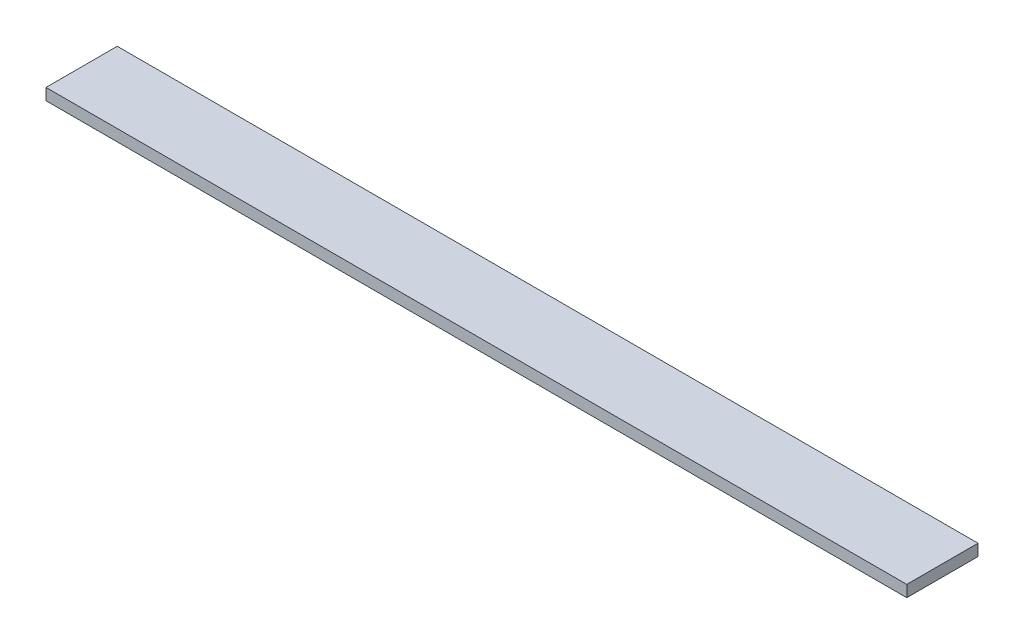
ISO-10303-21;
HEADER;
FILE_DESCRIPTION(('STEP AP214'),'2;1');
FILE_NAME('part.step','',(''),(''),'','','');
FILE_SCHEMA(('AUTOMOTIVE_DESIGN { 1 0 10303 214 1 1 1 1 }'));
ENDSEC;
DATA;
#1=APPLICATION_CONTEXT('core data for automotive mechanical design processes');
#2=APPLICATION_PROTOCOL_DEFINITION('international standard','automotive_design',2000,#1);
#3=PRODUCT_CONTEXT('',#1,'mechanical');
#4=PRODUCT('Part','Part','',(#3));
#5=PRODUCT_RELATED_PRODUCT_CATEGORY('part','',(#4));
#6=PRODUCT_DEFINITION_FORMATION('','',#4);
#7=PRODUCT_DEFINITION_CONTEXT('part definition',#1,'design');
#8=PRODUCT_DEFINITION('design','',#6,#7);
#9=PRODUCT_DEFINITION_SHAPE('','',#8);
#10=(LENGTH_UNIT() NAMED_UNIT(*) SI_UNIT(.MILLI.,.METRE.));
#11=(NAMED_UNIT(*) PLANE_ANGLE_UNIT() SI_UNIT($,.RADIAN.));
#12=(NAMED_UNIT(*) SI_UNIT($,.STERADIAN.) SOLID_ANGLE_UNIT());
#13=UNCERTAINTY_MEASURE_WITH_UNIT(LENGTH_MEASURE(1.E-05),#10,'distance_accuracy_value','');
#14=(GEOMETRIC_REPRESENTATION_CONTEXT(3) GLOBAL_UNCERTAINTY_ASSIGNED_CONTEXT((#13)) GLOBAL_UNIT_ASSIGNED_CONTEXT((#10,
#11,#12)) REPRESENTATION_CONTEXT('',''));
#15=CARTESIAN_POINT('',(0.,0.,0.));
#16=DIRECTION('',(0.,0.,1.));
#17=DIRECTION('',(1.,0.,0.));
#18=AXIS2_PLACEMENT_3D('',#15,#16,#17);
#19=CARTESIAN_POINT('',(-721.173913043478,38.1,-422.058695652174));
#20=DIRECTION('',(1.,0.,0.));
#21=DIRECTION('',(0.,0.,-1.));
#22=AXIS2_PLACEMENT_3D('',#19,#20,#21);
#23=PLANE('',#22);
#24=DIRECTION('',(0.,0.,1.));
#25=VECTOR('',#24,1.);
#26=CARTESIAN_POINT('',(-721.173913043478,0.,-422.058695652174));
#27=LINE('',#26,#25);
#28=CARTESIAN_POINT('',(-721.173913043478,0.,-422.058695652174));
#29=VERTEX_POINT('',#28);
#30=CARTESIAN_POINT('',(-721.173913043478,0.,-187.108695652174));
#31=VERTEX_POINT('',#30);
#32=EDGE_CURVE('E96',#29,#31,#27,.T.);
#33=ORIENTED_EDGE('',*,*,#32,.T.);
#34=DIRECTION('',(0.,-1.,0.));
#35=VECTOR('',#34,1.);
#36=CARTESIAN_POINT('',(-721.173913043478,38.1,-187.108695652174));
#37=LINE('',#36,#35);
#38=CARTESIAN_POINT('',(-721.173913043478,38.1,-187.108695652174));
#39=VERTEX_POINT('',#38);
#40=EDGE_CURVE('E11',#39,#31,#37,.T.);
#41=ORIENTED_EDGE('',*,*,#40,.F.);
#42=DIRECTION('',(0.,0.,1.));
#43=VECTOR('',#42,1.);
#44=CARTESIAN_POINT('',(-721.173913043478,38.1,-422.058695652174));
#45=LINE('',#44,#43);
#46=CARTESIAN_POINT('',(-721.173913043478,38.1,-422.058695652174));
#47=VERTEX_POINT('',#46);
#48=EDGE_CURVE('E82',#47,#39,#45,.T.);
#49=ORIENTED_EDGE('',*,*,#48,.F.);
#50=DIRECTION('',(0.,-1.,0.));
#51=VECTOR('',#50,1.);
#52=CARTESIAN_POINT('',(-721.173913043478,38.1,-422.058695652174));
#53=LINE('',#52,#51);
#54=EDGE_CURVE('E49',#47,#29,#53,.T.);
#55=ORIENTED_EDGE('',*,*,#54,.T.);
#56=EDGE_LOOP('',(#33,#41,#49,#55));
#57=FACE_BOUND('',#56,.T.);
#58=ADVANCED_FACE('F33',(#57),#23,.F.);
#59=CARTESIAN_POINT('',(-721.173913043478,38.1,-187.108695652174));
#60=DIRECTION('',(0.,0.,-1.));
#61=DIRECTION('',(-1.,0.,0.));
#62=AXIS2_PLACEMENT_3D('',#59,#60,#61);
#63=PLANE('',#62);
#64=DIRECTION('',(1.,0.,0.));
#65=VECTOR('',#64,1.);
#66=CARTESIAN_POINT('',(-721.173913043478,0.,-187.108695652174));
#67=LINE('',#66,#65);
#68=CARTESIAN_POINT('',(2117.27608695652,0.,-187.108695652174));
#69=VERTEX_POINT('',#68);
#70=EDGE_CURVE('E87',#31,#69,#67,.T.);
#71=ORIENTED_EDGE('',*,*,#70,.T.);
#72=DIRECTION('',(0.,-1.,0.));
#73=VECTOR('',#72,1.);
#74=CARTESIAN_POINT('',(2117.27608695652,38.1,-187.108695652174));
#75=LINE('',#74,#73);
#76=CARTESIAN_POINT('',(2117.27608695652,38.1,-187.108695652174));
#77=VERTEX_POINT('',#76);
#78=EDGE_CURVE('E41',#77,#69,#75,.T.);
#79=ORIENTED_EDGE('',*,*,#78,.F.);
#80=DIRECTION('',(1.,0.,0.));
#81=VECTOR('',#80,1.);
#82=CARTESIAN_POINT('',(-721.173913043478,38.1,-187.108695652174));
#83=LINE('',#82,#81);
#84=EDGE_CURVE('E74',#39,#77,#83,.T.);
#85=ORIENTED_EDGE('',*,*,#84,.F.);
#86=ORIENTED_EDGE('',*,*,#40,.T.);
#87=EDGE_LOOP('',(#71,#79,#85,#86));
#88=FACE_BOUND('',#87,.T.);
#89=ADVANCED_FACE('F86',(#88),#63,.F.);
#90=CARTESIAN_POINT('',(2117.27608695652,38.1,-422.058695652174));
#91=DIRECTION('',(1.,0.,0.));
#92=DIRECTION('',(0.,0.,-1.));
#93=AXIS2_PLACEMENT_3D('',#90,#91,#92);
#94=PLANE('',#93);
#95=DIRECTION('',(0.,0.,1.));
#96=VECTOR('',#95,1.);
#97=CARTESIAN_POINT('',(2117.27608695652,0.,-422.058695652174));
#98=LINE('',#97,#96);
#99=CARTESIAN_POINT('',(2117.27608695652,0.,-422.058695652174));
#100=VERTEX_POINT('',#99);
#101=EDGE_CURVE('E99',#100,#69,#98,.T.);
#102=ORIENTED_EDGE('',*,*,#101,.F.);
#103=DIRECTION('',(0.,-1.,0.));
#104=VECTOR('',#103,1.);
#105=CARTESIAN_POINT('',(2117.27608695652,38.1,-422.058695652174));
#106=LINE('',#105,#104);
#107=CARTESIAN_POINT('',(2117.27608695652,38.1,-422.058695652174));
#108=VERTEX_POINT('',#107);
#109=EDGE_CURVE('E63',#108,#100,#106,.T.);
#110=ORIENTED_EDGE('',*,*,#109,.F.);
#111=DIRECTION('',(0.,0.,1.));
#112=VECTOR('',#111,1.);
#113=CARTESIAN_POINT('',(2117.27608695652,38.1,-422.058695652174));
#114=LINE('',#113,#112);
#115=EDGE_CURVE('E81',#108,#77,#114,.T.);
#116=ORIENTED_EDGE('',*,*,#115,.T.);
#117=ORIENTED_EDGE('',*,*,#78,.T.);
#118=EDGE_LOOP('',(#102,#110,#116,#117));
#119=FACE_BOUND('',#118,.T.);
#120=ADVANCED_FACE('F90',(#119),#94,.T.);
#121=CARTESIAN_POINT('',(-721.173913043478,38.1,-422.058695652174));
#122=DIRECTION('',(0.,0.,-1.));
#123=DIRECTION('',(-1.,0.,0.));
#124=AXIS2_PLACEMENT_3D('',#121,#122,#123);
#125=PLANE('',#124);
#126=DIRECTION('',(1.,0.,0.));
#127=VECTOR('',#126,1.);
#128=CARTESIAN_POINT('',(-721.173913043478,0.,-422.058695652174));
#129=LINE('',#128,#127);
#130=EDGE_CURVE('E101',#29,#100,#129,.T.);
#131=ORIENTED_EDGE('',*,*,#130,.F.);
#132=ORIENTED_EDGE('',*,*,#54,.F.);
#133=DIRECTION('',(1.,0.,0.));
#134=VECTOR('',#133,1.);
#135=CARTESIAN_POINT('',(-721.173913043478,38.1,-422.058695652174));
#136=LINE('',#135,#134);
#137=EDGE_CURVE('E91',#47,#108,#136,.T.);
#138=ORIENTED_EDGE('',*,*,#137,.T.);
#139=ORIENTED_EDGE('',*,*,#109,.T.);
#140=EDGE_LOOP('',(#131,#132,#138,#139));
#141=FACE_BOUND('',#140,.T.);
#142=ADVANCED_FACE('F107',(#141),#125,.T.);
#143=CARTESIAN_POINT('',(0.,38.1,0.));
#144=DIRECTION('',(0.,1.,0.));
#145=DIRECTION('',(0.,0.,1.));
#146=AXIS2_PLACEMENT_3D('',#143,#144,#145);
#147=PLANE('',#146);
#148=ORIENTED_EDGE('',*,*,#48,.T.);
#149=ORIENTED_EDGE('',*,*,#84,.T.);
#150=ORIENTED_EDGE('',*,*,#115,.F.);
#151=ORIENTED_EDGE('',*,*,#137,.F.);
#152=EDGE_LOOP('',(#148,#149,#150,#151));
#153=FACE_BOUND('',#152,.T.);
#154=ADVANCED_FACE('F78',(#153),#147,.T.);
#155=CARTESIAN_POINT('',(0.,0.,0.));
#156=DIRECTION('',(0.,1.,0.));
#157=DIRECTION('',(0.,0.,1.));
#158=AXIS2_PLACEMENT_3D('',#155,#156,#157);
#159=PLANE('',#158);
#160=ORIENTED_EDGE('',*,*,#32,.F.);
#161=ORIENTED_EDGE('',*,*,#130,.T.);
#162=ORIENTED_EDGE('',*,*,#101,.T.);
#163=ORIENTED_EDGE('',*,*,#70,.F.);
#164=EDGE_LOOP('',(#160,#161,#162,#163));
#165=FACE_BOUND('',#164,.T.);
#166=ADVANCED_FACE('F106',(#165),#159,.F.);
#167=CLOSED_SHELL('',(#58,#89,#120,#142,#154,#166));
#168=MANIFOLD_SOLID_BREP('B2',#167);
#169=ADVANCED_BREP_SHAPE_REPRESENTATION('',(#18,#168),#14);
#170=SHAPE_DEFINITION_REPRESENTATION(#9,#169);
ENDSEC;
END-ISO-10303-21;
